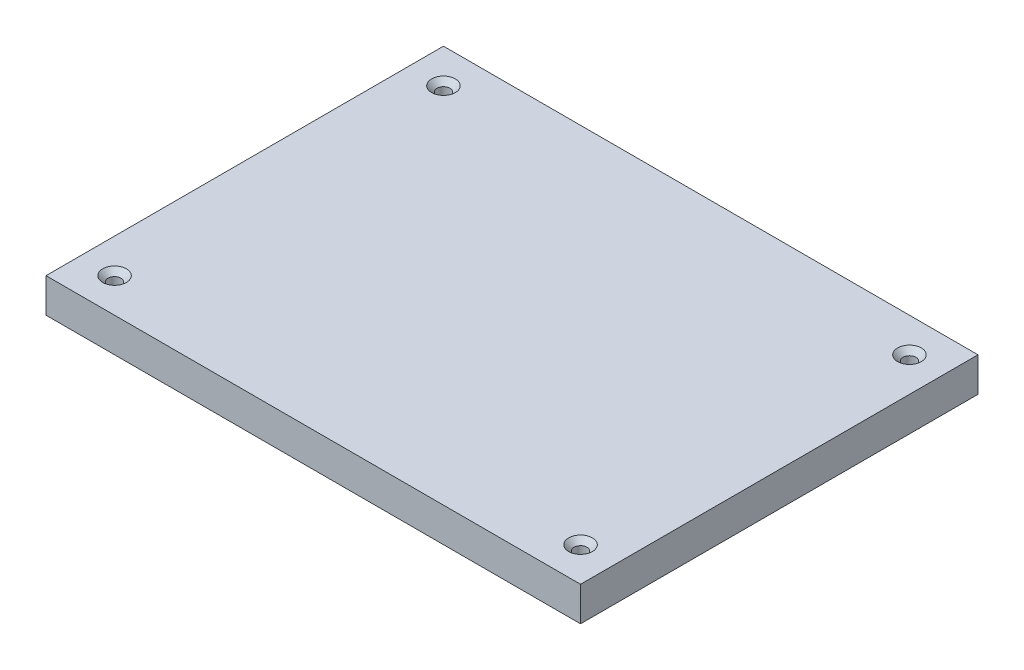
ISO-10303-21;
HEADER;
FILE_DESCRIPTION(('STEP AP214'),'2;1');
FILE_NAME('part.step','',(''),(''),'','','');
FILE_SCHEMA(('AUTOMOTIVE_DESIGN { 1 0 10303 214 1 1 1 1 }'));
ENDSEC;
DATA;
#1=APPLICATION_CONTEXT('core data for automotive mechanical design processes');
#2=APPLICATION_PROTOCOL_DEFINITION('international standard','automotive_design',2000,#1);
#3=PRODUCT_CONTEXT('',#1,'mechanical');
#4=PRODUCT('Part','Part','',(#3));
#5=PRODUCT_RELATED_PRODUCT_CATEGORY('part','',(#4));
#6=PRODUCT_DEFINITION_FORMATION('','',#4);
#7=PRODUCT_DEFINITION_CONTEXT('part definition',#1,'design');
#8=PRODUCT_DEFINITION('design','',#6,#7);
#9=PRODUCT_DEFINITION_SHAPE('','',#8);
#10=(LENGTH_UNIT() NAMED_UNIT(*) SI_UNIT(.MILLI.,.METRE.));
#11=(NAMED_UNIT(*) PLANE_ANGLE_UNIT() SI_UNIT($,.RADIAN.));
#12=(NAMED_UNIT(*) SI_UNIT($,.STERADIAN.) SOLID_ANGLE_UNIT());
#13=UNCERTAINTY_MEASURE_WITH_UNIT(LENGTH_MEASURE(1.E-05),#10,'distance_accuracy_value','');
#14=(GEOMETRIC_REPRESENTATION_CONTEXT(3) GLOBAL_UNCERTAINTY_ASSIGNED_CONTEXT((#13)) GLOBAL_UNIT_ASSIGNED_CONTEXT((#10,
#11,#12)) REPRESENTATION_CONTEXT('',''));
#15=CARTESIAN_POINT('',(0.,0.,0.));
#16=DIRECTION('',(0.,0.,1.));
#17=DIRECTION('',(1.,0.,0.));
#18=AXIS2_PLACEMENT_3D('',#15,#16,#17);
#19=CARTESIAN_POINT('',(49.53,6.35,36.83));
#20=DIRECTION('',(-1.,0.,0.));
#21=DIRECTION('',(0.,0.,1.));
#22=AXIS2_PLACEMENT_3D('',#19,#20,#21);
#23=PLANE('',#22);
#24=DIRECTION('',(0.,0.,-1.));
#25=VECTOR('',#24,1.);
#26=CARTESIAN_POINT('',(49.53,0.,36.83));
#27=LINE('',#26,#25);
#28=CARTESIAN_POINT('',(49.53,0.,36.83));
#29=VERTEX_POINT('',#28);
#30=CARTESIAN_POINT('',(49.53,0.,-36.83));
#31=VERTEX_POINT('',#30);
#32=EDGE_CURVE('E255',#29,#31,#27,.T.);
#33=ORIENTED_EDGE('',*,*,#32,.T.);
#34=DIRECTION('',(0.,-1.,0.));
#35=VECTOR('',#34,1.);
#36=CARTESIAN_POINT('',(49.53,6.35,-36.83));
#37=LINE('',#36,#35);
#38=CARTESIAN_POINT('',(49.53,6.35,-36.83));
#39=VERTEX_POINT('',#38);
#40=EDGE_CURVE('E11',#39,#31,#37,.T.);
#41=ORIENTED_EDGE('',*,*,#40,.F.);
#42=DIRECTION('',(0.,0.,-1.));
#43=VECTOR('',#42,1.);
#44=CARTESIAN_POINT('',(49.53,6.35,36.83));
#45=LINE('',#44,#43);
#46=CARTESIAN_POINT('',(49.53,6.35,36.83));
#47=VERTEX_POINT('',#46);
#48=EDGE_CURVE('E256',#47,#39,#45,.T.);
#49=ORIENTED_EDGE('',*,*,#48,.F.);
#50=DIRECTION('',(0.,-1.,0.));
#51=VECTOR('',#50,1.);
#52=CARTESIAN_POINT('',(49.53,6.35,36.83));
#53=LINE('',#52,#51);
#54=EDGE_CURVE('E266',#47,#29,#53,.T.);
#55=ORIENTED_EDGE('',*,*,#54,.T.);
#56=EDGE_LOOP('',(#33,#41,#49,#55));
#57=FACE_BOUND('',#56,.T.);
#58=ADVANCED_FACE('F42',(#57),#23,.F.);
#59=CARTESIAN_POINT('',(-49.53,6.35,-36.83));
#60=DIRECTION('',(0.,0.,1.));
#61=DIRECTION('',(1.,0.,0.));
#62=AXIS2_PLACEMENT_3D('',#59,#60,#61);
#63=PLANE('',#62);
#64=DIRECTION('',(-1.,0.,0.));
#65=VECTOR('',#64,1.);
#66=CARTESIAN_POINT('',(-49.53,0.,-36.83));
#67=LINE('',#66,#65);
#68=CARTESIAN_POINT('',(-49.53,0.,-36.83));
#69=VERTEX_POINT('',#68);
#70=EDGE_CURVE('E270',#31,#69,#67,.T.);
#71=ORIENTED_EDGE('',*,*,#70,.T.);
#72=DIRECTION('',(0.,-1.,0.));
#73=VECTOR('',#72,1.);
#74=CARTESIAN_POINT('',(-49.53,6.35,-36.83));
#75=LINE('',#74,#73);
#76=CARTESIAN_POINT('',(-49.53,6.35,-36.83));
#77=VERTEX_POINT('',#76);
#78=EDGE_CURVE('E50',#77,#69,#75,.T.);
#79=ORIENTED_EDGE('',*,*,#78,.F.);
#80=DIRECTION('',(-1.,0.,0.));
#81=VECTOR('',#80,1.);
#82=CARTESIAN_POINT('',(-49.53,6.35,-36.83));
#83=LINE('',#82,#81);
#84=EDGE_CURVE('E94',#39,#77,#83,.T.);
#85=ORIENTED_EDGE('',*,*,#84,.F.);
#86=ORIENTED_EDGE('',*,*,#40,.T.);
#87=EDGE_LOOP('',(#71,#79,#85,#86));
#88=FACE_BOUND('',#87,.T.);
#89=ADVANCED_FACE('F304',(#88),#63,.F.);
#90=CARTESIAN_POINT('',(-49.53,6.35,36.83));
#91=DIRECTION('',(1.,0.,0.));
#92=DIRECTION('',(0.,0.,-1.));
#93=AXIS2_PLACEMENT_3D('',#90,#91,#92);
#94=PLANE('',#93);
#95=DIRECTION('',(0.,0.,1.));
#96=VECTOR('',#95,1.);
#97=CARTESIAN_POINT('',(-49.53,0.,36.83));
#98=LINE('',#97,#96);
#99=CARTESIAN_POINT('',(-49.53,0.,36.83));
#100=VERTEX_POINT('',#99);
#101=EDGE_CURVE('E273',#69,#100,#98,.T.);
#102=ORIENTED_EDGE('',*,*,#101,.T.);
#103=DIRECTION('',(0.,-1.,0.));
#104=VECTOR('',#103,1.);
#105=CARTESIAN_POINT('',(-49.53,6.35,36.83));
#106=LINE('',#105,#104);
#107=CARTESIAN_POINT('',(-49.53,6.35,36.83));
#108=VERTEX_POINT('',#107);
#109=EDGE_CURVE('E280',#108,#100,#106,.T.);
#110=ORIENTED_EDGE('',*,*,#109,.F.);
#111=DIRECTION('',(0.,0.,1.));
#112=VECTOR('',#111,1.);
#113=CARTESIAN_POINT('',(-49.53,6.35,36.83));
#114=LINE('',#113,#112);
#115=EDGE_CURVE('E261',#77,#108,#114,.T.);
#116=ORIENTED_EDGE('',*,*,#115,.F.);
#117=ORIENTED_EDGE('',*,*,#78,.T.);
#118=EDGE_LOOP('',(#102,#110,#116,#117));
#119=FACE_BOUND('',#118,.T.);
#120=ADVANCED_FACE('F287',(#119),#94,.F.);
#121=CARTESIAN_POINT('',(-49.53,6.35,36.83));
#122=DIRECTION('',(0.,0.,-1.));
#123=DIRECTION('',(-1.,0.,0.));
#124=AXIS2_PLACEMENT_3D('',#121,#122,#123);
#125=PLANE('',#124);
#126=DIRECTION('',(1.,0.,0.));
#127=VECTOR('',#126,1.);
#128=CARTESIAN_POINT('',(-49.53,0.,36.83));
#129=LINE('',#128,#127);
#130=EDGE_CURVE('E87',#100,#29,#129,.T.);
#131=ORIENTED_EDGE('',*,*,#130,.T.);
#132=ORIENTED_EDGE('',*,*,#54,.F.);
#133=DIRECTION('',(1.,0.,0.));
#134=VECTOR('',#133,1.);
#135=CARTESIAN_POINT('',(-49.53,6.35,36.83));
#136=LINE('',#135,#134);
#137=EDGE_CURVE('E66',#108,#47,#136,.T.);
#138=ORIENTED_EDGE('',*,*,#137,.F.);
#139=ORIENTED_EDGE('',*,*,#109,.T.);
#140=EDGE_LOOP('',(#131,#132,#138,#139));
#141=FACE_BOUND('',#140,.T.);
#142=ADVANCED_FACE('F294',(#141),#125,.F.);
#143=CARTESIAN_POINT('',(0.,6.35,0.));
#144=DIRECTION('',(0.,-1.,0.));
#145=DIRECTION('',(0.,0.,-1.));
#146=AXIS2_PLACEMENT_3D('',#143,#144,#145);
#147=PLANE('',#146);
#148=CARTESIAN_POINT('',(-43.18,6.35,-30.48));
#149=DIRECTION('',(0.,1.,0.));
#150=DIRECTION('',(0.,0.,1.));
#151=AXIS2_PLACEMENT_3D('',#148,#149,#150);
#152=CIRCLE('',#151,2.2);
#153=CARTESIAN_POINT('',(-43.18,6.35,-28.28));
#154=VERTEX_POINT('',#153);
#155=EDGE_CURVE('E207',#154,#154,#152,.T.);
#156=ORIENTED_EDGE('',*,*,#155,.F.);
#157=EDGE_LOOP('',(#156));
#158=FACE_BOUND('',#157,.T.);
#159=CARTESIAN_POINT('',(-43.18,6.35,30.48));
#160=DIRECTION('',(0.,1.,0.));
#161=DIRECTION('',(0.,0.,1.));
#162=AXIS2_PLACEMENT_3D('',#159,#160,#161);
#163=CIRCLE('',#162,2.2);
#164=CARTESIAN_POINT('',(-43.18,6.35,32.68));
#165=VERTEX_POINT('',#164);
#166=EDGE_CURVE('E219',#165,#165,#163,.T.);
#167=ORIENTED_EDGE('',*,*,#166,.F.);
#168=EDGE_LOOP('',(#167));
#169=FACE_BOUND('',#168,.T.);
#170=CARTESIAN_POINT('',(43.18,6.35,30.48));
#171=DIRECTION('',(0.,1.,0.));
#172=DIRECTION('',(0.,0.,1.));
#173=AXIS2_PLACEMENT_3D('',#170,#171,#172);
#174=CIRCLE('',#173,2.2);
#175=CARTESIAN_POINT('',(43.18,6.35,32.68));
#176=VERTEX_POINT('',#175);
#177=EDGE_CURVE('E231',#176,#176,#174,.T.);
#178=ORIENTED_EDGE('',*,*,#177,.F.);
#179=EDGE_LOOP('',(#178));
#180=FACE_BOUND('',#179,.T.);
#181=CARTESIAN_POINT('',(43.18,6.35,-30.48));
#182=DIRECTION('',(0.,1.,0.));
#183=DIRECTION('',(0.,0.,1.));
#184=AXIS2_PLACEMENT_3D('',#181,#182,#183);
#185=CIRCLE('',#184,2.2);
#186=CARTESIAN_POINT('',(43.18,6.35,-28.28));
#187=VERTEX_POINT('',#186);
#188=EDGE_CURVE('E243',#187,#187,#185,.T.);
#189=ORIENTED_EDGE('',*,*,#188,.F.);
#190=EDGE_LOOP('',(#189));
#191=FACE_BOUND('',#190,.T.);
#192=ORIENTED_EDGE('',*,*,#48,.T.);
#193=ORIENTED_EDGE('',*,*,#84,.T.);
#194=ORIENTED_EDGE('',*,*,#115,.T.);
#195=ORIENTED_EDGE('',*,*,#137,.T.);
#196=EDGE_LOOP('',(#192,#193,#194,#195));
#197=FACE_BOUND('',#196,.T.);
#198=ADVANCED_FACE('F296',(#158,#169,#180,#191,#197),#147,.F.);
#199=CARTESIAN_POINT('',(0.,0.,0.));
#200=DIRECTION('',(0.,-1.,0.));
#201=DIRECTION('',(0.,0.,-1.));
#202=AXIS2_PLACEMENT_3D('',#199,#200,#201);
#203=PLANE('',#202);
#204=CARTESIAN_POINT('',(43.18,0.,-30.48));
#205=DIRECTION('',(0.,-1.,0.));
#206=DIRECTION('',(0.,0.,-1.));
#207=AXIS2_PLACEMENT_3D('',#204,#205,#206);
#208=CIRCLE('',#207,5.96249999999999);
#209=CARTESIAN_POINT('',(37.4327180337137,0.,-32.0675));
#210=VERTEX_POINT('',#209);
#211=CARTESIAN_POINT('',(44.7675,0.,-24.7327180337137));
#212=VERTEX_POINT('',#211);
#213=EDGE_CURVE('E576',#210,#212,#208,.F.);
#214=ORIENTED_EDGE('',*,*,#213,.F.);
#215=DIRECTION('',(-1.,0.,0.));
#216=VECTOR('',#215,1.);
#217=CARTESIAN_POINT('',(0.,0.,-32.0675));
#218=LINE('',#217,#216);
#219=CARTESIAN_POINT('',(-37.4327180337137,0.,-32.0675));
#220=VERTEX_POINT('',#219);
#221=EDGE_CURVE('E159',#210,#220,#218,.T.);
#222=ORIENTED_EDGE('',*,*,#221,.T.);
#223=CARTESIAN_POINT('',(-43.18,0.,-30.48));
#224=DIRECTION('',(0.,-1.,0.));
#225=DIRECTION('',(0.,0.,-1.));
#226=AXIS2_PLACEMENT_3D('',#223,#224,#225);
#227=CIRCLE('',#226,5.96249999999999);
#228=CARTESIAN_POINT('',(-44.7675,0.,-24.7327180337137));
#229=VERTEX_POINT('',#228);
#230=EDGE_CURVE('E57',#229,#220,#227,.F.);
#231=ORIENTED_EDGE('',*,*,#230,.F.);
#232=DIRECTION('',(0.,0.,1.));
#233=VECTOR('',#232,1.);
#234=CARTESIAN_POINT('',(-44.7675,0.,0.));
#235=LINE('',#234,#233);
#236=CARTESIAN_POINT('',(-44.7675,0.,24.7327180337137));
#237=VERTEX_POINT('',#236);
#238=EDGE_CURVE('E151',#229,#237,#235,.T.);
#239=ORIENTED_EDGE('',*,*,#238,.T.);
#240=CARTESIAN_POINT('',(-43.18,0.,30.48));
#241=DIRECTION('',(0.,-1.,0.));
#242=DIRECTION('',(0.,0.,-1.));
#243=AXIS2_PLACEMENT_3D('',#240,#241,#242);
#244=CIRCLE('',#243,5.96249999999999);
#245=CARTESIAN_POINT('',(-37.4327180337137,0.,32.0675));
#246=VERTEX_POINT('',#245);
#247=EDGE_CURVE('E167',#246,#237,#244,.F.);
#248=ORIENTED_EDGE('',*,*,#247,.F.);
#249=DIRECTION('',(1.,0.,0.));
#250=VECTOR('',#249,1.);
#251=CARTESIAN_POINT('',(0.,0.,32.0675));
#252=LINE('',#251,#250);
#253=CARTESIAN_POINT('',(37.4327180337137,0.,32.0675));
#254=VERTEX_POINT('',#253);
#255=EDGE_CURVE('E158',#246,#254,#252,.T.);
#256=ORIENTED_EDGE('',*,*,#255,.T.);
#257=CARTESIAN_POINT('',(43.18,0.,30.48));
#258=DIRECTION('',(0.,-1.,0.));
#259=DIRECTION('',(0.,0.,-1.));
#260=AXIS2_PLACEMENT_3D('',#257,#258,#259);
#261=CIRCLE('',#260,5.96249999999999);
#262=CARTESIAN_POINT('',(44.7675,0.,24.7327180337137));
#263=VERTEX_POINT('',#262);
#264=EDGE_CURVE('E170',#263,#254,#261,.F.);
#265=ORIENTED_EDGE('',*,*,#264,.F.);
#266=DIRECTION('',(0.,0.,-1.));
#267=VECTOR('',#266,1.);
#268=CARTESIAN_POINT('',(44.7675,0.,0.));
#269=LINE('',#268,#267);
#270=EDGE_CURVE('E571',#263,#212,#269,.T.);
#271=ORIENTED_EDGE('',*,*,#270,.T.);
#272=EDGE_LOOP('',(#214,#222,#231,#239,#248,#256,#265,#271));
#273=FACE_BOUND('',#272,.T.);
#274=CARTESIAN_POINT('',(-43.18,0.,-30.48));
#275=DIRECTION('',(0.,1.,0.));
#276=DIRECTION('',(0.,0.,1.));
#277=AXIS2_PLACEMENT_3D('',#274,#275,#276);
#278=CIRCLE('',#277,1.19999999999999);
#279=CARTESIAN_POINT('',(-43.18,0.,-29.28));
#280=VERTEX_POINT('',#279);
#281=EDGE_CURVE('E215',#280,#280,#278,.T.);
#282=ORIENTED_EDGE('',*,*,#281,.T.);
#283=EDGE_LOOP('',(#282));
#284=FACE_BOUND('',#283,.T.);
#285=CARTESIAN_POINT('',(-43.18,0.,30.48));
#286=DIRECTION('',(0.,1.,0.));
#287=DIRECTION('',(0.,0.,1.));
#288=AXIS2_PLACEMENT_3D('',#285,#286,#287);
#289=CIRCLE('',#288,1.19999999999999);
#290=CARTESIAN_POINT('',(-43.18,0.,31.68));
#291=VERTEX_POINT('',#290);
#292=EDGE_CURVE('E227',#291,#291,#289,.T.);
#293=ORIENTED_EDGE('',*,*,#292,.T.);
#294=EDGE_LOOP('',(#293));
#295=FACE_BOUND('',#294,.T.);
#296=CARTESIAN_POINT('',(43.18,0.,30.48));
#297=DIRECTION('',(0.,1.,0.));
#298=DIRECTION('',(0.,0.,1.));
#299=AXIS2_PLACEMENT_3D('',#296,#297,#298);
#300=CIRCLE('',#299,1.19999999999999);
#301=CARTESIAN_POINT('',(43.18,0.,31.68));
#302=VERTEX_POINT('',#301);
#303=EDGE_CURVE('E239',#302,#302,#300,.T.);
#304=ORIENTED_EDGE('',*,*,#303,.T.);
#305=EDGE_LOOP('',(#304));
#306=FACE_BOUND('',#305,.T.);
#307=CARTESIAN_POINT('',(43.18,0.,-30.48));
#308=DIRECTION('',(0.,1.,0.));
#309=DIRECTION('',(0.,0.,1.));
#310=AXIS2_PLACEMENT_3D('',#307,#308,#309);
#311=CIRCLE('',#310,1.19999999999999);
#312=CARTESIAN_POINT('',(43.18,0.,-29.28));
#313=VERTEX_POINT('',#312);
#314=EDGE_CURVE('E251',#313,#313,#311,.T.);
#315=ORIENTED_EDGE('',*,*,#314,.T.);
#316=EDGE_LOOP('',(#315));
#317=FACE_BOUND('',#316,.T.);
#318=ORIENTED_EDGE('',*,*,#32,.F.);
#319=ORIENTED_EDGE('',*,*,#130,.F.);
#320=ORIENTED_EDGE('',*,*,#101,.F.);
#321=ORIENTED_EDGE('',*,*,#70,.F.);
#322=EDGE_LOOP('',(#318,#319,#320,#321));
#323=FACE_BOUND('',#322,.T.);
#324=ADVANCED_FACE('F163',(#273,#284,#295,#306,#317,#323),#203,.T.);
#325=CARTESIAN_POINT('',(43.18,6.35,-30.48));
#326=DIRECTION('',(0.,1.,0.));
#327=DIRECTION('',(0.,0.,1.));
#328=AXIS2_PLACEMENT_3D('',#325,#326,#327);
#329=CYLINDRICAL_SURFACE('',#328,1.19999999999999);
#330=ORIENTED_EDGE('',*,*,#314,.F.);
#331=EDGE_LOOP('',(#330));
#332=FACE_BOUND('',#331,.T.);
#333=CARTESIAN_POINT('',(43.18,5.35,-30.48));
#334=DIRECTION('',(0.,1.,0.));
#335=DIRECTION('',(0.,0.,1.));
#336=AXIS2_PLACEMENT_3D('',#333,#334,#335);
#337=CIRCLE('',#336,1.19999999999999);
#338=CARTESIAN_POINT('',(43.18,5.35,-29.28));
#339=VERTEX_POINT('',#338);
#340=EDGE_CURVE('E247',#339,#339,#337,.T.);
#341=ORIENTED_EDGE('',*,*,#340,.T.);
#342=EDGE_LOOP('',(#341));
#343=FACE_BOUND('',#342,.T.);
#344=ADVANCED_FACE('F337',(#332,#343),#329,.F.);
#345=CARTESIAN_POINT('',(43.18,6.35,-30.48));
#346=DIRECTION('',(0.,1.,0.));
#347=DIRECTION('',(0.,0.,1.));
#348=AXIS2_PLACEMENT_3D('',#345,#346,#347);
#349=CONICAL_SURFACE('',#348,2.2,0.785398163397449);
#350=ORIENTED_EDGE('',*,*,#340,.F.);
#351=EDGE_LOOP('',(#350));
#352=FACE_BOUND('',#351,.T.);
#353=ORIENTED_EDGE('',*,*,#188,.T.);
#354=EDGE_LOOP('',(#353));
#355=FACE_BOUND('',#354,.T.);
#356=ADVANCED_FACE('F342',(#352,#355),#349,.F.);
#357=CARTESIAN_POINT('',(43.18,6.35,30.48));
#358=DIRECTION('',(0.,1.,0.));
#359=DIRECTION('',(0.,0.,1.));
#360=AXIS2_PLACEMENT_3D('',#357,#358,#359);
#361=CYLINDRICAL_SURFACE('',#360,1.19999999999999);
#362=ORIENTED_EDGE('',*,*,#303,.F.);
#363=EDGE_LOOP('',(#362));
#364=FACE_BOUND('',#363,.T.);
#365=CARTESIAN_POINT('',(43.18,5.35,30.48));
#366=DIRECTION('',(0.,1.,0.));
#367=DIRECTION('',(0.,0.,1.));
#368=AXIS2_PLACEMENT_3D('',#365,#366,#367);
#369=CIRCLE('',#368,1.19999999999999);
#370=CARTESIAN_POINT('',(43.18,5.35,31.68));
#371=VERTEX_POINT('',#370);
#372=EDGE_CURVE('E235',#371,#371,#369,.T.);
#373=ORIENTED_EDGE('',*,*,#372,.T.);
#374=EDGE_LOOP('',(#373));
#375=FACE_BOUND('',#374,.T.);
#376=ADVANCED_FACE('F353',(#364,#375),#361,.F.);
#377=CARTESIAN_POINT('',(43.18,6.35,30.48));
#378=DIRECTION('',(0.,1.,0.));
#379=DIRECTION('',(0.,0.,1.));
#380=AXIS2_PLACEMENT_3D('',#377,#378,#379);
#381=CONICAL_SURFACE('',#380,2.2,0.785398163397449);
#382=ORIENTED_EDGE('',*,*,#372,.F.);
#383=EDGE_LOOP('',(#382));
#384=FACE_BOUND('',#383,.T.);
#385=ORIENTED_EDGE('',*,*,#177,.T.);
#386=EDGE_LOOP('',(#385));
#387=FACE_BOUND('',#386,.T.);
#388=ADVANCED_FACE('F364',(#384,#387),#381,.F.);
#389=CARTESIAN_POINT('',(-43.18,6.35,30.48));
#390=DIRECTION('',(0.,1.,0.));
#391=DIRECTION('',(0.,0.,1.));
#392=AXIS2_PLACEMENT_3D('',#389,#390,#391);
#393=CYLINDRICAL_SURFACE('',#392,1.19999999999999);
#394=ORIENTED_EDGE('',*,*,#292,.F.);
#395=EDGE_LOOP('',(#394));
#396=FACE_BOUND('',#395,.T.);
#397=CARTESIAN_POINT('',(-43.18,5.35,30.48));
#398=DIRECTION('',(0.,1.,0.));
#399=DIRECTION('',(0.,0.,1.));
#400=AXIS2_PLACEMENT_3D('',#397,#398,#399);
#401=CIRCLE('',#400,1.19999999999999);
#402=CARTESIAN_POINT('',(-43.18,5.35,31.68));
#403=VERTEX_POINT('',#402);
#404=EDGE_CURVE('E223',#403,#403,#401,.T.);
#405=ORIENTED_EDGE('',*,*,#404,.T.);
#406=EDGE_LOOP('',(#405));
#407=FACE_BOUND('',#406,.T.);
#408=ADVANCED_FACE('F375',(#396,#407),#393,.F.);
#409=CARTESIAN_POINT('',(-43.18,6.35,30.48));
#410=DIRECTION('',(0.,1.,0.));
#411=DIRECTION('',(0.,0.,1.));
#412=AXIS2_PLACEMENT_3D('',#409,#410,#411);
#413=CONICAL_SURFACE('',#412,2.2,0.785398163397449);
#414=ORIENTED_EDGE('',*,*,#404,.F.);
#415=EDGE_LOOP('',(#414));
#416=FACE_BOUND('',#415,.T.);
#417=ORIENTED_EDGE('',*,*,#166,.T.);
#418=EDGE_LOOP('',(#417));
#419=FACE_BOUND('',#418,.T.);
#420=ADVANCED_FACE('F386',(#416,#419),#413,.F.);
#421=CARTESIAN_POINT('',(-43.18,6.35,-30.48));
#422=DIRECTION('',(0.,1.,0.));
#423=DIRECTION('',(0.,0.,1.));
#424=AXIS2_PLACEMENT_3D('',#421,#422,#423);
#425=CYLINDRICAL_SURFACE('',#424,1.19999999999999);
#426=ORIENTED_EDGE('',*,*,#281,.F.);
#427=EDGE_LOOP('',(#426));
#428=FACE_BOUND('',#427,.T.);
#429=CARTESIAN_POINT('',(-43.18,5.35,-30.48));
#430=DIRECTION('',(0.,1.,0.));
#431=DIRECTION('',(0.,0.,1.));
#432=AXIS2_PLACEMENT_3D('',#429,#430,#431);
#433=CIRCLE('',#432,1.19999999999999);
#434=CARTESIAN_POINT('',(-43.18,5.35,-29.28));
#435=VERTEX_POINT('',#434);
#436=EDGE_CURVE('E211',#435,#435,#433,.T.);
#437=ORIENTED_EDGE('',*,*,#436,.T.);
#438=EDGE_LOOP('',(#437));
#439=FACE_BOUND('',#438,.T.);
#440=ADVANCED_FACE('F397',(#428,#439),#425,.F.);
#441=CARTESIAN_POINT('',(-43.18,6.35,-30.48));
#442=DIRECTION('',(0.,1.,0.));
#443=DIRECTION('',(0.,0.,1.));
#444=AXIS2_PLACEMENT_3D('',#441,#442,#443);
#445=CONICAL_SURFACE('',#444,2.2,0.785398163397449);
#446=ORIENTED_EDGE('',*,*,#436,.F.);
#447=EDGE_LOOP('',(#446));
#448=FACE_BOUND('',#447,.T.);
#449=ORIENTED_EDGE('',*,*,#155,.T.);
#450=EDGE_LOOP('',(#449));
#451=FACE_BOUND('',#450,.T.);
#452=ADVANCED_FACE('F408',(#448,#451),#445,.F.);
#453=CARTESIAN_POINT('',(0.,1.5875,0.));
#454=DIRECTION('',(0.,-1.,0.));
#455=DIRECTION('',(0.,0.,-1.));
#456=AXIS2_PLACEMENT_3D('',#453,#454,#455);
#457=PLANE('',#456);
#458=CARTESIAN_POINT('',(-43.18,1.5875,-30.48));
#459=DIRECTION('',(0.,-1.,0.));
#460=DIRECTION('',(0.,0.,-1.));
#461=AXIS2_PLACEMENT_3D('',#458,#459,#460);
#462=CIRCLE('',#461,5.96249999999999);
#463=CARTESIAN_POINT('',(-44.7675,1.5875,-24.7327180337137));
#464=VERTEX_POINT('',#463);
#465=CARTESIAN_POINT('',(-37.4327180337137,1.5875,-32.0675));
#466=VERTEX_POINT('',#465);
#467=EDGE_CURVE('E142',#464,#466,#462,.F.);
#468=ORIENTED_EDGE('',*,*,#467,.T.);
#469=DIRECTION('',(-1.,0.,0.));
#470=VECTOR('',#469,1.);
#471=CARTESIAN_POINT('',(0.,1.5875,-32.0675));
#472=LINE('',#471,#470);
#473=CARTESIAN_POINT('',(37.4327180337137,1.5875,-32.0675));
#474=VERTEX_POINT('',#473);
#475=EDGE_CURVE('E568',#474,#466,#472,.T.);
#476=ORIENTED_EDGE('',*,*,#475,.F.);
#477=CARTESIAN_POINT('',(43.18,1.5875,-30.48));
#478=DIRECTION('',(0.,-1.,0.));
#479=DIRECTION('',(0.,0.,-1.));
#480=AXIS2_PLACEMENT_3D('',#477,#478,#479);
#481=CIRCLE('',#480,5.96249999999999);
#482=CARTESIAN_POINT('',(44.7675,1.5875,-24.7327180337137));
#483=VERTEX_POINT('',#482);
#484=EDGE_CURVE('E193',#474,#483,#481,.F.);
#485=ORIENTED_EDGE('',*,*,#484,.T.);
#486=DIRECTION('',(0.,0.,-1.));
#487=VECTOR('',#486,1.);
#488=CARTESIAN_POINT('',(44.7675,1.5875,0.));
#489=LINE('',#488,#487);
#490=CARTESIAN_POINT('',(44.7675,1.5875,24.7327180337137));
#491=VERTEX_POINT('',#490);
#492=EDGE_CURVE('E564',#491,#483,#489,.T.);
#493=ORIENTED_EDGE('',*,*,#492,.F.);
#494=CARTESIAN_POINT('',(43.18,1.5875,30.48));
#495=DIRECTION('',(0.,-1.,0.));
#496=DIRECTION('',(0.,0.,-1.));
#497=AXIS2_PLACEMENT_3D('',#494,#495,#496);
#498=CIRCLE('',#497,5.96249999999999);
#499=CARTESIAN_POINT('',(37.4327180337137,1.5875,32.0675));
#500=VERTEX_POINT('',#499);
#501=EDGE_CURVE('E197',#491,#500,#498,.F.);
#502=ORIENTED_EDGE('',*,*,#501,.T.);
#503=DIRECTION('',(1.,0.,0.));
#504=VECTOR('',#503,1.);
#505=CARTESIAN_POINT('',(0.,1.5875,32.0675));
#506=LINE('',#505,#504);
#507=CARTESIAN_POINT('',(-37.4327180337137,1.5875,32.0675));
#508=VERTEX_POINT('',#507);
#509=EDGE_CURVE('E178',#508,#500,#506,.T.);
#510=ORIENTED_EDGE('',*,*,#509,.F.);
#511=CARTESIAN_POINT('',(-43.18,1.5875,30.48));
#512=DIRECTION('',(0.,-1.,0.));
#513=DIRECTION('',(0.,0.,-1.));
#514=AXIS2_PLACEMENT_3D('',#511,#512,#513);
#515=CIRCLE('',#514,5.96249999999999);
#516=CARTESIAN_POINT('',(-44.7675,1.5875,24.7327180337137));
#517=VERTEX_POINT('',#516);
#518=EDGE_CURVE('E201',#508,#517,#515,.F.);
#519=ORIENTED_EDGE('',*,*,#518,.T.);
#520=DIRECTION('',(0.,0.,1.));
#521=VECTOR('',#520,1.);
#522=CARTESIAN_POINT('',(-44.7675,1.5875,0.));
#523=LINE('',#522,#521);
#524=EDGE_CURVE('E588',#464,#517,#523,.T.);
#525=ORIENTED_EDGE('',*,*,#524,.F.);
#526=EDGE_LOOP('',(#468,#476,#485,#493,#502,#510,#519,#525));
#527=FACE_BOUND('',#526,.T.);
#528=ADVANCED_FACE('F419',(#527),#457,.T.);
#529=CARTESIAN_POINT('',(44.7675,6.35,36.83));
#530=DIRECTION('',(-1.,0.,0.));
#531=DIRECTION('',(0.,0.,1.));
#532=AXIS2_PLACEMENT_3D('',#529,#530,#531);
#533=PLANE('',#532);
#534=DIRECTION('',(0.,1.,0.));
#535=VECTOR('',#534,1.);
#536=CARTESIAN_POINT('',(44.7675,6.35,24.7327180337137));
#537=LINE('',#536,#535);
#538=EDGE_CURVE('E181',#263,#491,#537,.T.);
#539=ORIENTED_EDGE('',*,*,#538,.T.);
#540=ORIENTED_EDGE('',*,*,#492,.T.);
#541=DIRECTION('',(0.,1.,0.));
#542=VECTOR('',#541,1.);
#543=CARTESIAN_POINT('',(44.7675,6.35,-24.7327180337137));
#544=LINE('',#543,#542);
#545=EDGE_CURVE('E174',#212,#483,#544,.T.);
#546=ORIENTED_EDGE('',*,*,#545,.F.);
#547=ORIENTED_EDGE('',*,*,#270,.F.);
#548=EDGE_LOOP('',(#539,#540,#546,#547));
#549=FACE_BOUND('',#548,.T.);
#550=ADVANCED_FACE('F434',(#549),#533,.T.);
#551=CARTESIAN_POINT('',(-49.53,6.35,-32.0675));
#552=DIRECTION('',(0.,0.,1.));
#553=DIRECTION('',(1.,0.,0.));
#554=AXIS2_PLACEMENT_3D('',#551,#552,#553);
#555=PLANE('',#554);
#556=ORIENTED_EDGE('',*,*,#221,.F.);
#557=DIRECTION('',(0.,1.,0.));
#558=VECTOR('',#557,1.);
#559=CARTESIAN_POINT('',(37.4327180337137,6.35,-32.0675));
#560=LINE('',#559,#558);
#561=EDGE_CURVE('E177',#210,#474,#560,.T.);
#562=ORIENTED_EDGE('',*,*,#561,.T.);
#563=ORIENTED_EDGE('',*,*,#475,.T.);
#564=DIRECTION('',(0.,1.,0.));
#565=VECTOR('',#564,1.);
#566=CARTESIAN_POINT('',(-37.4327180337137,6.35,-32.0675));
#567=LINE('',#566,#565);
#568=EDGE_CURVE('E147',#220,#466,#567,.T.);
#569=ORIENTED_EDGE('',*,*,#568,.F.);
#570=EDGE_LOOP('',(#556,#562,#563,#569));
#571=FACE_BOUND('',#570,.T.);
#572=ADVANCED_FACE('F443',(#571),#555,.T.);
#573=CARTESIAN_POINT('',(-44.7675,6.35,36.83));
#574=DIRECTION('',(1.,0.,0.));
#575=DIRECTION('',(0.,0.,-1.));
#576=AXIS2_PLACEMENT_3D('',#573,#574,#575);
#577=PLANE('',#576);
#578=DIRECTION('',(0.,1.,0.));
#579=VECTOR('',#578,1.);
#580=CARTESIAN_POINT('',(-44.7675,6.35,-24.7327180337137));
#581=LINE('',#580,#579);
#582=EDGE_CURVE('E138',#229,#464,#581,.T.);
#583=ORIENTED_EDGE('',*,*,#582,.T.);
#584=ORIENTED_EDGE('',*,*,#524,.T.);
#585=DIRECTION('',(0.,1.,0.));
#586=VECTOR('',#585,1.);
#587=CARTESIAN_POINT('',(-44.7675,6.35,24.7327180337137));
#588=LINE('',#587,#586);
#589=EDGE_CURVE('E153',#237,#517,#588,.T.);
#590=ORIENTED_EDGE('',*,*,#589,.F.);
#591=ORIENTED_EDGE('',*,*,#238,.F.);
#592=EDGE_LOOP('',(#583,#584,#590,#591));
#593=FACE_BOUND('',#592,.T.);
#594=ADVANCED_FACE('F152',(#593),#577,.T.);
#595=CARTESIAN_POINT('',(-49.53,6.35,32.0675));
#596=DIRECTION('',(0.,0.,-1.));
#597=DIRECTION('',(-1.,0.,0.));
#598=AXIS2_PLACEMENT_3D('',#595,#596,#597);
#599=PLANE('',#598);
#600=DIRECTION('',(0.,1.,0.));
#601=VECTOR('',#600,1.);
#602=CARTESIAN_POINT('',(-37.4327180337137,6.35,32.0675));
#603=LINE('',#602,#601);
#604=EDGE_CURVE('E148',#246,#508,#603,.T.);
#605=ORIENTED_EDGE('',*,*,#604,.T.);
#606=ORIENTED_EDGE('',*,*,#509,.T.);
#607=DIRECTION('',(0.,1.,0.));
#608=VECTOR('',#607,1.);
#609=CARTESIAN_POINT('',(37.4327180337137,6.35,32.0675));
#610=LINE('',#609,#608);
#611=EDGE_CURVE('E184',#254,#500,#610,.T.);
#612=ORIENTED_EDGE('',*,*,#611,.F.);
#613=ORIENTED_EDGE('',*,*,#255,.F.);
#614=EDGE_LOOP('',(#605,#606,#612,#613));
#615=FACE_BOUND('',#614,.T.);
#616=ADVANCED_FACE('F460',(#615),#599,.T.);
#617=CARTESIAN_POINT('',(43.18,6.35,-30.48));
#618=DIRECTION('',(0.,1.,0.));
#619=DIRECTION('',(0.,0.,1.));
#620=AXIS2_PLACEMENT_3D('',#617,#618,#619);
#621=CYLINDRICAL_SURFACE('',#620,5.96249999999999);
#622=ORIENTED_EDGE('',*,*,#561,.F.);
#623=ORIENTED_EDGE('',*,*,#213,.T.);
#624=ORIENTED_EDGE('',*,*,#545,.T.);
#625=ORIENTED_EDGE('',*,*,#484,.F.);
#626=EDGE_LOOP('',(#622,#623,#624,#625));
#627=FACE_BOUND('',#626,.T.);
#628=ADVANCED_FACE('F467',(#627),#621,.T.);
#629=CARTESIAN_POINT('',(43.18,6.35,30.48));
#630=DIRECTION('',(0.,1.,0.));
#631=DIRECTION('',(0.,0.,1.));
#632=AXIS2_PLACEMENT_3D('',#629,#630,#631);
#633=CYLINDRICAL_SURFACE('',#632,5.96249999999999);
#634=ORIENTED_EDGE('',*,*,#538,.F.);
#635=ORIENTED_EDGE('',*,*,#264,.T.);
#636=ORIENTED_EDGE('',*,*,#611,.T.);
#637=ORIENTED_EDGE('',*,*,#501,.F.);
#638=EDGE_LOOP('',(#634,#635,#636,#637));
#639=FACE_BOUND('',#638,.T.);
#640=ADVANCED_FACE('F475',(#639),#633,.T.);
#641=CARTESIAN_POINT('',(-43.18,6.35,30.48));
#642=DIRECTION('',(0.,1.,0.));
#643=DIRECTION('',(0.,0.,1.));
#644=AXIS2_PLACEMENT_3D('',#641,#642,#643);
#645=CYLINDRICAL_SURFACE('',#644,5.96249999999999);
#646=ORIENTED_EDGE('',*,*,#604,.F.);
#647=ORIENTED_EDGE('',*,*,#247,.T.);
#648=ORIENTED_EDGE('',*,*,#589,.T.);
#649=ORIENTED_EDGE('',*,*,#518,.F.);
#650=EDGE_LOOP('',(#646,#647,#648,#649));
#651=FACE_BOUND('',#650,.T.);
#652=ADVANCED_FACE('F484',(#651),#645,.T.);
#653=CARTESIAN_POINT('',(-43.18,6.35,-30.48));
#654=DIRECTION('',(0.,1.,0.));
#655=DIRECTION('',(0.,0.,1.));
#656=AXIS2_PLACEMENT_3D('',#653,#654,#655);
#657=CYLINDRICAL_SURFACE('',#656,5.96249999999999);
#658=ORIENTED_EDGE('',*,*,#582,.F.);
#659=ORIENTED_EDGE('',*,*,#230,.T.);
#660=ORIENTED_EDGE('',*,*,#568,.T.);
#661=ORIENTED_EDGE('',*,*,#467,.F.);
#662=EDGE_LOOP('',(#658,#659,#660,#661));
#663=FACE_BOUND('',#662,.T.);
#664=ADVANCED_FACE('F140',(#663),#657,.T.);
#665=CLOSED_SHELL('',(#58,#89,#120,#142,#198,#324,#344,#356,#376,#388,#408,#420,#440,#452,#528,
#550,#572,#594,#616,#628,#640,#652,#664));
#666=MANIFOLD_SOLID_BREP('B2',#665);
#667=ADVANCED_BREP_SHAPE_REPRESENTATION('',(#18,#666),#14);
#668=SHAPE_DEFINITION_REPRESENTATION(#9,#667);
ENDSEC;
END-ISO-10303-21;
